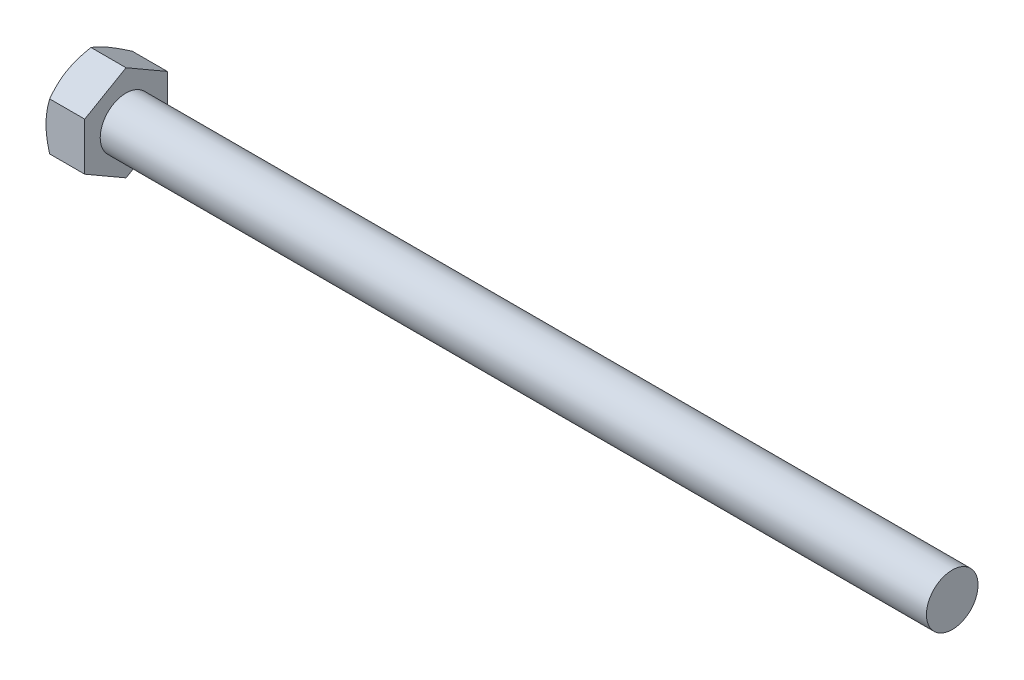
ISO-10303-21;
HEADER;
FILE_DESCRIPTION(('STEP AP214'),'2;1');
FILE_NAME('part.step','',(''),(''),'','','');
FILE_SCHEMA(('AUTOMOTIVE_DESIGN { 1 0 10303 214 1 1 1 1 }'));
ENDSEC;
DATA;
#1=APPLICATION_CONTEXT('core data for automotive mechanical design processes');
#2=APPLICATION_PROTOCOL_DEFINITION('international standard','automotive_design',2000,#1);
#3=PRODUCT_CONTEXT('',#1,'mechanical');
#4=PRODUCT('Part','Part','',(#3));
#5=PRODUCT_RELATED_PRODUCT_CATEGORY('part','',(#4));
#6=PRODUCT_DEFINITION_FORMATION('','',#4);
#7=PRODUCT_DEFINITION_CONTEXT('part definition',#1,'design');
#8=PRODUCT_DEFINITION('design','',#6,#7);
#9=PRODUCT_DEFINITION_SHAPE('','',#8);
#10=(LENGTH_UNIT() NAMED_UNIT(*) SI_UNIT(.MILLI.,.METRE.));
#11=(NAMED_UNIT(*) PLANE_ANGLE_UNIT() SI_UNIT($,.RADIAN.));
#12=(NAMED_UNIT(*) SI_UNIT($,.STERADIAN.) SOLID_ANGLE_UNIT());
#13=UNCERTAINTY_MEASURE_WITH_UNIT(LENGTH_MEASURE(1.E-05),#10,'distance_accuracy_value','');
#14=(GEOMETRIC_REPRESENTATION_CONTEXT(3) GLOBAL_UNCERTAINTY_ASSIGNED_CONTEXT((#13)) GLOBAL_UNIT_ASSIGNED_CONTEXT((#10,
#11,#12)) REPRESENTATION_CONTEXT('',''));
#15=CARTESIAN_POINT('',(0.,0.,0.));
#16=DIRECTION('',(0.,0.,1.));
#17=DIRECTION('',(1.,0.,0.));
#18=AXIS2_PLACEMENT_3D('',#15,#16,#17);
#19=CARTESIAN_POINT('',(7.5,5.,0.));
#20=DIRECTION('',(-1.,0.,0.));
#21=DIRECTION('',(0.,0.,1.));
#22=AXIS2_PLACEMENT_3D('',#19,#20,#21);
#23=PLANE('',#22);
#24=CARTESIAN_POINT('',(7.5,0.,0.));
#25=DIRECTION('',(-1.,0.,0.));
#26=DIRECTION('',(0.,0.,1.));
#27=AXIS2_PLACEMENT_3D('',#24,#25,#26);
#28=CIRCLE('',#27,5.);
#29=CARTESIAN_POINT('',(7.5,0.,5.));
#30=VERTEX_POINT('',#29);
#31=EDGE_CURVE('E196',#30,#30,#28,.T.);
#32=ORIENTED_EDGE('',*,*,#31,.T.);
#33=EDGE_LOOP('',(#32));
#34=FACE_BOUND('',#33,.T.);
#35=DIRECTION('',(0.,1.,0.));
#36=VECTOR('',#35,1.);
#37=CARTESIAN_POINT('',(7.5,-4.61880217370055,8.));
#38=LINE('',#37,#36);
#39=CARTESIAN_POINT('',(7.5,-4.61880217370055,8.));
#40=VERTEX_POINT('',#39);
#41=CARTESIAN_POINT('',(7.5,4.61880217370081,8.));
#42=VERTEX_POINT('',#41);
#43=EDGE_CURVE('E56',#40,#42,#38,.T.);
#44=ORIENTED_EDGE('',*,*,#43,.F.);
#45=DIRECTION('',(0.,0.500000001638709,0.866025402838329));
#46=VECTOR('',#45,1.);
#47=CARTESIAN_POINT('',(7.5,-9.23760434740122,0.));
#48=LINE('',#47,#46);
#49=CARTESIAN_POINT('',(7.5,-9.23760434740122,0.));
#50=VERTEX_POINT('',#49);
#51=EDGE_CURVE('E129',#50,#40,#48,.T.);
#52=ORIENTED_EDGE('',*,*,#51,.F.);
#53=DIRECTION('',(0.,-0.50000000163871,0.866025402838329));
#54=VECTOR('',#53,1.);
#55=CARTESIAN_POINT('',(7.5,-4.61880217370055,-8.));
#56=LINE('',#55,#54);
#57=CARTESIAN_POINT('',(7.5,-4.61880217370055,-8.));
#58=VERTEX_POINT('',#57);
#59=EDGE_CURVE('E127',#58,#50,#56,.T.);
#60=ORIENTED_EDGE('',*,*,#59,.F.);
#61=DIRECTION('',(0.,-1.,0.));
#62=VECTOR('',#61,1.);
#63=CARTESIAN_POINT('',(7.5,4.61880217370081,-8.));
#64=LINE('',#63,#62);
#65=CARTESIAN_POINT('',(7.5,4.61880217370081,-8.));
#66=VERTEX_POINT('',#65);
#67=EDGE_CURVE('E110',#66,#58,#64,.T.);
#68=ORIENTED_EDGE('',*,*,#67,.F.);
#69=DIRECTION('',(0.,-0.50000000163871,-0.866025402838329));
#70=VECTOR('',#69,1.);
#71=CARTESIAN_POINT('',(7.5,9.23760434740148,0.));
#72=LINE('',#71,#70);
#73=CARTESIAN_POINT('',(7.5,9.23760434740148,0.));
#74=VERTEX_POINT('',#73);
#75=EDGE_CURVE('E119',#74,#66,#72,.T.);
#76=ORIENTED_EDGE('',*,*,#75,.F.);
#77=DIRECTION('',(0.,0.50000000163871,-0.866025402838329));
#78=VECTOR('',#77,1.);
#79=CARTESIAN_POINT('',(7.5,4.61880217370081,8.));
#80=LINE('',#79,#78);
#81=EDGE_CURVE('E123',#42,#74,#80,.T.);
#82=ORIENTED_EDGE('',*,*,#81,.F.);
#83=EDGE_LOOP('',(#44,#52,#60,#68,#76,#82));
#84=FACE_BOUND('',#83,.T.);
#85=ADVANCED_FACE('F33',(#34,#84),#23,.F.);
#86=CARTESIAN_POINT('',(-25.4,0.,0.));
#87=DIRECTION('',(-1.,0.,0.));
#88=DIRECTION('',(0.,0.,1.));
#89=AXIS2_PLACEMENT_3D('',#86,#87,#88);
#90=CYLINDRICAL_SURFACE('',#89,5.);
#91=CARTESIAN_POINT('',(167.5,0.,0.));
#92=DIRECTION('',(-1.,0.,0.));
#93=DIRECTION('',(0.,0.,1.));
#94=AXIS2_PLACEMENT_3D('',#91,#92,#93);
#95=CIRCLE('',#94,5.);
#96=CARTESIAN_POINT('',(167.5,0.,5.));
#97=VERTEX_POINT('',#96);
#98=EDGE_CURVE('E11',#97,#97,#95,.T.);
#99=ORIENTED_EDGE('',*,*,#98,.T.);
#100=EDGE_LOOP('',(#99));
#101=FACE_BOUND('',#100,.T.);
#102=ORIENTED_EDGE('',*,*,#31,.F.);
#103=EDGE_LOOP('',(#102));
#104=FACE_BOUND('',#103,.T.);
#105=ADVANCED_FACE('F35',(#101,#104),#90,.T.);
#106=CARTESIAN_POINT('',(167.5,5.,0.));
#107=DIRECTION('',(1.,0.,0.));
#108=DIRECTION('',(0.,0.,-1.));
#109=AXIS2_PLACEMENT_3D('',#106,#107,#108);
#110=PLANE('',#109);
#111=ORIENTED_EDGE('',*,*,#98,.F.);
#112=EDGE_LOOP('',(#111));
#113=FACE_BOUND('',#112,.T.);
#114=ADVANCED_FACE('F177',(#113),#110,.T.);
#115=CARTESIAN_POINT('',(7.5,-4.61880217370055,8.));
#116=DIRECTION('',(0.,0.,1.));
#117=DIRECTION('',(0.,-1.,0.));
#118=AXIS2_PLACEMENT_3D('',#115,#116,#117);
#119=PLANE('',#118);
#120=DIRECTION('',(-1.,0.,0.));
#121=VECTOR('',#120,1.);
#122=CARTESIAN_POINT('',(7.5,-4.61880217370055,8.));
#123=LINE('',#122,#121);
#124=CARTESIAN_POINT('',(0.714531185642814,-4.61880217370055,8.));
#125=VERTEX_POINT('',#124);
#126=EDGE_CURVE('E136',#40,#125,#123,.T.);
#127=ORIENTED_EDGE('',*,*,#126,.F.);
#128=ORIENTED_EDGE('',*,*,#43,.T.);
#129=DIRECTION('',(-1.,0.,0.));
#130=VECTOR('',#129,1.);
#131=CARTESIAN_POINT('',(7.5,4.61880217370081,8.));
#132=LINE('',#131,#130);
#133=CARTESIAN_POINT('',(0.714531185642887,4.61880217370081,8.));
#134=VERTEX_POINT('',#133);
#135=EDGE_CURVE('E135',#42,#134,#132,.T.);
#136=ORIENTED_EDGE('',*,*,#135,.T.);
#137=CARTESIAN_POINT('',(3.82822414101115,-12.2497656982226,8.));
#138=CARTESIAN_POINT('',(3.65848286879736,-11.8985202843054,8.));
#139=CARTESIAN_POINT('',(3.49042895769106,-11.546444421205,8.));
#140=CARTESIAN_POINT('',(3.15866007606797,-10.8401827517385,8.));
#141=CARTESIAN_POINT('',(2.99494585678539,-10.4859965928938,8.));
#142=CARTESIAN_POINT('',(2.67195812645104,-9.77315201266955,8.));
#143=CARTESIAN_POINT('',(2.51271538890513,-9.41447959727726,8.));
#144=CARTESIAN_POINT('',(2.20106973608564,-8.6941868708221,8.));
#145=CARTESIAN_POINT('',(2.04866646428538,-8.33256671458254,8.));
#146=CARTESIAN_POINT('',(1.75070912610617,-7.60131370455928,8.));
#147=CARTESIAN_POINT('',(1.60526212024156,-7.23163698414151,8.));
#148=CARTESIAN_POINT('',(1.32575932370829,-6.487924160903,8.));
#149=CARTESIAN_POINT('',(1.19170480039105,-6.11388757832081,8.));
#150=CARTESIAN_POINT('',(0.938589488850542,-5.36162356561332,8.));
#151=CARTESIAN_POINT('',(0.819496824182946,-4.98340697934676,8.));
#152=CARTESIAN_POINT('',(0.600170997908562,-4.22161055060635,8.));
#153=CARTESIAN_POINT('',(0.499931872278403,-3.83803244555409,8.));
#154=CARTESIAN_POINT('',(0.323186748232363,-3.06518689861531,8.));
#155=CARTESIAN_POINT('',(0.246687067909599,-2.67591797096946,8.));
#156=CARTESIAN_POINT('',(0.153572527253884,-2.08858914234208,8.));
#157=CARTESIAN_POINT('',(0.126138156302342,-1.8922178640948,8.));
#158=CARTESIAN_POINT('',(0.0790208692877559,-1.49855462524935,8.));
#159=CARTESIAN_POINT('',(0.0593371858268336,-1.30126275775715,8.));
#160=CARTESIAN_POINT('',(0.0282509892994569,-0.907276578206894,8.));
#161=CARTESIAN_POINT('',(0.0167970522476313,-0.710586340026115,8.));
#162=CARTESIAN_POINT('',(0.00223090595896762,-0.316897324952118,8.));
#163=CARTESIAN_POINT('',(-0.000881411608064448,-0.119898552098995,8.));
#164=CARTESIAN_POINT('',(0.00130984053934154,0.27399753841406,8.));
#165=CARTESIAN_POINT('',(0.00661104833168806,0.470894869030629,8.));
#166=CARTESIAN_POINT('',(0.0254975236721206,0.864294473957556,8.));
#167=CARTESIAN_POINT('',(0.0390832049236028,1.06079672804721,8.));
#168=CARTESIAN_POINT('',(0.0817669665798386,1.53705699197599,8.));
#169=CARTESIAN_POINT('',(0.115015825491784,1.81644908989183,8.));
#170=CARTESIAN_POINT('',(0.196415724202097,2.37309234461894,8.));
#171=CARTESIAN_POINT('',(0.244570831513706,2.65034289586915,8.));
#172=CARTESIAN_POINT('',(0.354075319593893,3.20247432368565,8.));
#173=CARTESIAN_POINT('',(0.415437175577183,3.47735270235345,8.));
#174=CARTESIAN_POINT('',(0.549482936842529,4.02428135859502,8.));
#175=CARTESIAN_POINT('',(0.622165775535711,4.29633190001607,8.));
#176=CARTESIAN_POINT('',(0.77901457585663,4.8443054564892,8.));
#177=CARTESIAN_POINT('',(0.863418343438941,5.12015993256326,8.));
#178=CARTESIAN_POINT('',(1.04056550506417,5.66895309638315,8.));
#179=CARTESIAN_POINT('',(1.13330314694985,5.94189365197878,8.));
#180=CARTESIAN_POINT('',(1.32520246628364,6.48376376437684,8.));
#181=CARTESIAN_POINT('',(1.4243250469162,6.75270725047684,8.));
#182=CARTESIAN_POINT('',(1.62838816906516,7.28850759026012,8.));
#183=CARTESIAN_POINT('',(1.73333106198454,7.55536355016897,8.));
#184=CARTESIAN_POINT('',(1.84060835471514,7.82125004980532,8.));
#185=B_SPLINE_CURVE_WITH_KNOTS('',3,(#137,#138,#139,#140,#141,#142,#143,#144,#145,#146,#147,
#148,#149,#150,#151,#152,#153,#154,#155,#156,#157,#158,#159,#160,#161,#162,#163,#164,#165,#166,
#167,#168,#169,#170,#171,#172,#173,#174,#175,#176,#177,#178,#179,#180,#181,#182,#183,#184),
.UNSPECIFIED.,.F.,.F.,(4,2,2,2,2,2,2,2,2,2,2,2,2,2,2,2,2,2,2,2,2,2,2,4),(0.,1.17034426617222,
2.34088982216394,3.51813389970139,4.6953165385788,5.88695165739568,7.07871916605351,
8.2679029134146,9.45670984600032,10.6458329007116,11.2405391306507,11.8351864637341,
12.4260850123376,13.0169758870758,13.6077009108412,14.1984554361754,15.0420758899104,
15.8859267481502,16.7305782416716,17.5751502057393,18.4404245595524,19.3051062097701,
20.1649208601746,21.0250854420212),.UNSPECIFIED.);
#186=CARTESIAN_POINT('',(0.,0.,8.));
#187=VERTEX_POINT('',#186);
#188=EDGE_CURVE('E179',#187,#134,#185,.T.);
#189=ORIENTED_EDGE('',*,*,#188,.F.);
#190=EDGE_CURVE('E187',#125,#187,#185,.T.);
#191=ORIENTED_EDGE('',*,*,#190,.F.);
#192=EDGE_LOOP('',(#127,#128,#136,#189,#191));
#193=FACE_BOUND('',#192,.T.);
#194=ADVANCED_FACE('F173',(#193),#119,.T.);
#195=CARTESIAN_POINT('',(7.5,-9.23760434740122,0.));
#196=DIRECTION('',(0.,-0.866025402838329,0.500000001638709));
#197=DIRECTION('',(0.,-0.50000000163871,-0.86602540283833));
#198=AXIS2_PLACEMENT_3D('',#195,#196,#197);
#199=PLANE('',#198);
#200=DIRECTION('',(-1.,0.,0.));
#201=VECTOR('',#200,1.);
#202=CARTESIAN_POINT('',(7.5,-9.23760434740122,0.));
#203=LINE('',#202,#201);
#204=CARTESIAN_POINT('',(0.714531203122347,-9.23760434740122,0.));
#205=VERTEX_POINT('',#204);
#206=EDGE_CURVE('E140',#50,#205,#203,.T.);
#207=ORIENTED_EDGE('',*,*,#206,.F.);
#208=ORIENTED_EDGE('',*,*,#51,.T.);
#209=ORIENTED_EDGE('',*,*,#126,.T.);
#210=CARTESIAN_POINT('',(0.714597871039289,-9.23771981745557,-0.000200000000002933));
#211=CARTESIAN_POINT('',(0.655990736923303,-9.13619347400029,0.175648784402792));
#212=CARTESIAN_POINT('',(0.600043423495616,-9.03428860437912,0.352153195354022));
#213=CARTESIAN_POINT('',(0.494201026626133,-8.82965126370277,0.706595464982374));
#214=CARTESIAN_POINT('',(0.444308555613357,-8.7269184556666,0.884533907327666));
#215=CARTESIAN_POINT('',(0.30469281714608,-8.41707515629909,1.42119824187181));
#216=CARTESIAN_POINT('',(0.225281190112559,-8.20874157525887,1.78204258757938));
#217=CARTESIAN_POINT('',(0.132161664305383,-7.89697439751329,2.32203917720735));
#218=CARTESIAN_POINT('',(0.105634598683677,-7.79447219608365,2.49957819719532));
#219=CARTESIAN_POINT('',(0.0611531918321778,-7.58900424766936,2.85545912162066));
#220=CARTESIAN_POINT('',(0.0431980931629678,-7.4860385424529,3.03380095371339));
#221=CARTESIAN_POINT('',(0.0163156645301111,-7.27992984087247,3.39079169517273));
#222=CARTESIAN_POINT('',(0.00737808929916338,-7.17678717937825,3.56944002452792));
#223=CARTESIAN_POINT('',(-0.00127768080583362,-6.97040657400776,3.92690171716437));
#224=CARTESIAN_POINT('',(-0.000996160506704941,-6.86716863317371,4.10571507517634));
#225=CARTESIAN_POINT('',(0.00814503983248396,-6.67416141624368,4.44001337966577));
#226=CARTESIAN_POINT('',(0.0158896186877163,-6.58437852030024,4.59552191641092));
#227=CARTESIAN_POINT('',(0.0382011486356475,-6.40502300933048,4.90617477267051));
#228=CARTESIAN_POINT('',(0.0527685596255872,-6.31545040888835,5.06131906692437));
#229=CARTESIAN_POINT('',(0.106360703064376,-6.04707937863194,5.52615132457682));
#230=CARTESIAN_POINT('',(0.155268653484355,-5.86875598870038,5.83501649476649));
#231=CARTESIAN_POINT('',(0.277539413477509,-5.51021757899271,6.45602323413139));
#232=CARTESIAN_POINT('',(0.351420529762536,-5.33004831822991,6.768085546371));
#233=CARTESIAN_POINT('',(0.519100148881199,-4.97239660419655,7.38755648378386));
#234=CARTESIAN_POINT('',(0.612859267577917,-4.79490957082323,7.69497304192775));
#235=CARTESIAN_POINT('',(0.714597853559101,-4.61868670364621,8.0002));
#236=B_SPLINE_CURVE_WITH_KNOTS('',3,(#210,#211,#212,#213,#214,#215,#216,#217,#218,#219,#220,
#221,#222,#223,#224,#225,#226,#227,#228,#229,#230,#231,#232,#233,#234,#235),.UNSPECIFIED.,.F.,
.F.,(4,2,2,2,2,2,2,2,2,2,2,2,4),(0.,0.633973546459013,1.26821966262013,2.53934713534089,
3.15934345345195,3.77928497706708,4.39852135771862,5.01773860688775,5.55680241439713,
6.09590256306806,7.17487079008232,8.27776851436756,9.37850116222514),.UNSPECIFIED.);
#237=CARTESIAN_POINT('',(0.,-6.92820324541317,4.0000000262193));
#238=VERTEX_POINT('',#237);
#239=EDGE_CURVE('E189',#238,#125,#236,.T.);
#240=ORIENTED_EDGE('',*,*,#239,.F.);
#241=EDGE_CURVE('E188',#205,#238,#236,.T.);
#242=ORIENTED_EDGE('',*,*,#241,.F.);
#243=EDGE_LOOP('',(#207,#208,#209,#240,#242));
#244=FACE_BOUND('',#243,.T.);
#245=ADVANCED_FACE('F176',(#244),#199,.T.);
#246=CARTESIAN_POINT('',(7.5,-4.61880217370055,-8.));
#247=DIRECTION('',(0.,-0.866025402838329,-0.50000000163871));
#248=DIRECTION('',(0.,0.50000000163871,-0.866025402838329));
#249=AXIS2_PLACEMENT_3D('',#246,#247,#248);
#250=PLANE('',#249);
#251=DIRECTION('',(-1.,0.,0.));
#252=VECTOR('',#251,1.);
#253=CARTESIAN_POINT('',(7.5,-4.61880217370055,-8.));
#254=LINE('',#253,#252);
#255=CARTESIAN_POINT('',(0.714531185642814,-4.61880217370055,-8.));
#256=VERTEX_POINT('',#255);
#257=EDGE_CURVE('E116',#58,#256,#254,.T.);
#258=ORIENTED_EDGE('',*,*,#257,.F.);
#259=ORIENTED_EDGE('',*,*,#59,.T.);
#260=ORIENTED_EDGE('',*,*,#206,.T.);
#261=CARTESIAN_POINT('',(0.714597853559102,-4.61868670364621,-8.0002));
#262=CARTESIAN_POINT('',(0.655990720160656,-4.72021304685638,-7.82435121602175));
#263=CARTESIAN_POINT('',(0.600043407468511,-4.82211791623125,-7.64784680549711));
#264=CARTESIAN_POINT('',(0.494201012103502,-5.02675525640989,-7.29340453673082));
#265=CARTESIAN_POINT('',(0.444308541859671,-5.12948806419463,-7.11546609482101));
#266=CARTESIAN_POINT('',(0.304692805754267,-5.43933136278073,-6.57880176163032));
#267=CARTESIAN_POINT('',(0.225281180357153,-5.64766494327923,-6.21795741686103));
#268=CARTESIAN_POINT('',(0.132161657001097,-5.95943212018714,-5.67796082868395));
#269=CARTESIAN_POINT('',(0.105634592184732,-6.06193432134328,-5.5004218091697));
#270=CARTESIAN_POINT('',(0.0611531869346931,-6.2674022691947,-5.14454088571928));
#271=CARTESIAN_POINT('',(0.043198089061611,-6.37036797412179,-4.96619905412775));
#272=CARTESIAN_POINT('',(0.0163156619914865,-6.57647667510862,-4.60920831369654));
#273=CARTESIAN_POINT('',(0.00737808752735882,-6.67961933629864,-4.43055998486825));
#274=CARTESIAN_POINT('',(-0.00127768109245702,-6.88599994104392,-4.07309829331471));
#275=CARTESIAN_POINT('',(-0.000996160074949981,-6.98923788155696,-3.89428493585874));
#276=CARTESIAN_POINT('',(0.00814504157393716,-7.18224509847458,-3.5599866313908));
#277=CARTESIAN_POINT('',(0.015889621075361,-7.27202799472783,-3.40447809410903));
#278=CARTESIAN_POINT('',(0.0382011523455289,-7.45138350630451,-3.09382523679824));
#279=CARTESIAN_POINT('',(0.0527685640115247,-7.54095610704372,-2.93868094202981));
#280=CARTESIAN_POINT('',(0.106360709504679,-7.80932713817435,-2.47384868286318));
#281=CARTESIAN_POINT('',(0.155268661328168,-7.98765052866423,-2.16498351170646));
#282=CARTESIAN_POINT('',(0.277539424141198,-8.34618893947704,-1.54397677042741));
#283=CARTESIAN_POINT('',(0.351420541844036,-8.52635820078562,-1.23191445724248));
#284=CARTESIAN_POINT('',(0.519100163726596,-8.88400991587941,-0.612443517992909));
#285=CARTESIAN_POINT('',(0.612859283768842,-9.0614969497675,-0.305026958957413));
#286=CARTESIAN_POINT('',(0.714597871039288,-9.23771981745556,0.000199999999995336));
#287=B_SPLINE_CURVE_WITH_KNOTS('',3,(#261,#262,#263,#264,#265,#266,#267,#268,#269,#270,#271,
#272,#273,#274,#275,#276,#277,#278,#279,#280,#281,#282,#283,#284,#285,#286),.UNSPECIFIED.,.F.,
.F.,(4,2,2,2,2,2,2,2,2,2,2,2,4),(0.,0.633973544448733,1.26821965859846,2.539347127198,
3.1593434433715,3.77928496504979,4.39852134377931,5.01773859102754,5.55680240047656,
6.09590255108796,7.17487078199376,8.27776851034646,9.37850116222566),.UNSPECIFIED.);
#288=CARTESIAN_POINT('',(0.,-6.92820324541317,-4.0000000262193));
#289=VERTEX_POINT('',#288);
#290=EDGE_CURVE('E219',#289,#205,#287,.T.);
#291=ORIENTED_EDGE('',*,*,#290,.F.);
#292=EDGE_CURVE('E224',#256,#289,#287,.T.);
#293=ORIENTED_EDGE('',*,*,#292,.F.);
#294=EDGE_LOOP('',(#258,#259,#260,#291,#293));
#295=FACE_BOUND('',#294,.T.);
#296=ADVANCED_FACE('F295',(#295),#250,.T.);
#297=CARTESIAN_POINT('',(7.5,4.61880217370081,-8.));
#298=DIRECTION('',(0.,0.,-1.));
#299=DIRECTION('',(-1.,0.,0.));
#300=AXIS2_PLACEMENT_3D('',#297,#298,#299);
#301=PLANE('',#300);
#302=DIRECTION('',(-1.,0.,0.));
#303=VECTOR('',#302,1.);
#304=CARTESIAN_POINT('',(7.5,4.61880217370081,-8.));
#305=LINE('',#304,#303);
#306=CARTESIAN_POINT('',(0.714531185642888,4.61880217370081,-8.));
#307=VERTEX_POINT('',#306);
#308=EDGE_CURVE('E105',#66,#307,#305,.T.);
#309=ORIENTED_EDGE('',*,*,#308,.F.);
#310=ORIENTED_EDGE('',*,*,#67,.T.);
#311=ORIENTED_EDGE('',*,*,#257,.T.);
#312=CARTESIAN_POINT('',(3.82822414101115,-12.2497656982226,-8.));
#313=CARTESIAN_POINT('',(3.65848286879736,-11.8985202843054,-8.));
#314=CARTESIAN_POINT('',(3.49042895769106,-11.546444421205,-8.));
#315=CARTESIAN_POINT('',(3.15866007606797,-10.8401827517385,-8.));
#316=CARTESIAN_POINT('',(2.99494585678539,-10.4859965928938,-8.));
#317=CARTESIAN_POINT('',(2.67195812645104,-9.77315201266955,-8.));
#318=CARTESIAN_POINT('',(2.51271538890513,-9.41447959727726,-8.));
#319=CARTESIAN_POINT('',(2.20106973608564,-8.6941868708221,-8.));
#320=CARTESIAN_POINT('',(2.04866646428538,-8.33256671458254,-8.));
#321=CARTESIAN_POINT('',(1.75070912610617,-7.60131370455928,-8.));
#322=CARTESIAN_POINT('',(1.60526212024156,-7.23163698414151,-8.));
#323=CARTESIAN_POINT('',(1.32575932370829,-6.487924160903,-8.));
#324=CARTESIAN_POINT('',(1.19170480039105,-6.11388757832081,-8.));
#325=CARTESIAN_POINT('',(0.938589488850542,-5.36162356561332,-8.));
#326=CARTESIAN_POINT('',(0.819496824182947,-4.98340697934676,-8.));
#327=CARTESIAN_POINT('',(0.600170997908562,-4.22161055060635,-8.));
#328=CARTESIAN_POINT('',(0.499931872278403,-3.83803244555409,-8.));
#329=CARTESIAN_POINT('',(0.323186748232363,-3.06518689861531,-8.));
#330=CARTESIAN_POINT('',(0.246687067909599,-2.67591797096946,-8.));
#331=CARTESIAN_POINT('',(0.153572527253885,-2.08858914234208,-8.));
#332=CARTESIAN_POINT('',(0.126138156302343,-1.8922178640948,-8.));
#333=CARTESIAN_POINT('',(0.0790208692877563,-1.49855462524935,-8.));
#334=CARTESIAN_POINT('',(0.059337185826834,-1.30126275775715,-8.));
#335=CARTESIAN_POINT('',(0.0282509892994573,-0.907276578206893,-8.));
#336=CARTESIAN_POINT('',(0.0167970522476317,-0.710586340026114,-8.));
#337=CARTESIAN_POINT('',(0.0022309059589681,-0.316897324952118,-8.));
#338=CARTESIAN_POINT('',(-0.000881411608063976,-0.119898552098995,-8.));
#339=CARTESIAN_POINT('',(0.00130984053934208,0.27399753841406,-8.));
#340=CARTESIAN_POINT('',(0.00661104833168869,0.470894869030628,-8.));
#341=CARTESIAN_POINT('',(0.0254975236721212,0.864294473957555,-8.));
#342=CARTESIAN_POINT('',(0.0390832049236034,1.0607967280472,-8.));
#343=CARTESIAN_POINT('',(0.0817669665798393,1.53705699197599,-8.));
#344=CARTESIAN_POINT('',(0.115015825491784,1.81644908989183,-8.));
#345=CARTESIAN_POINT('',(0.196415724202097,2.37309234461894,-8.));
#346=CARTESIAN_POINT('',(0.244570831513706,2.65034289586915,-8.));
#347=CARTESIAN_POINT('',(0.354075319593893,3.20247432368565,-8.));
#348=CARTESIAN_POINT('',(0.415437175577183,3.47735270235344,-8.));
#349=CARTESIAN_POINT('',(0.549482936842529,4.02428135859502,-8.));
#350=CARTESIAN_POINT('',(0.622165775535711,4.29633190001607,-8.));
#351=CARTESIAN_POINT('',(0.77901457585663,4.84430545648919,-8.));
#352=CARTESIAN_POINT('',(0.863418343438941,5.12015993256325,-8.));
#353=CARTESIAN_POINT('',(1.04056550506417,5.66895309638315,-8.));
#354=CARTESIAN_POINT('',(1.13330314694985,5.94189365197878,-8.));
#355=CARTESIAN_POINT('',(1.32520246628364,6.48376376437684,-8.));
#356=CARTESIAN_POINT('',(1.4243250469162,6.75270725047684,-8.));
#357=CARTESIAN_POINT('',(1.62838816906517,7.28850759026012,-8.));
#358=CARTESIAN_POINT('',(1.73333106198454,7.55536355016897,-8.));
#359=CARTESIAN_POINT('',(1.84060835471514,7.82125004980532,-8.));
#360=B_SPLINE_CURVE_WITH_KNOTS('',3,(#312,#313,#314,#315,#316,#317,#318,#319,#320,#321,#322,
#323,#324,#325,#326,#327,#328,#329,#330,#331,#332,#333,#334,#335,#336,#337,#338,#339,#340,#341,
#342,#343,#344,#345,#346,#347,#348,#349,#350,#351,#352,#353,#354,#355,#356,#357,#358,#359),
.UNSPECIFIED.,.F.,.F.,(4,2,2,2,2,2,2,2,2,2,2,2,2,2,2,2,2,2,2,2,2,2,2,4),(0.,1.17034426617222,
2.34088982216393,3.51813389970139,4.6953165385788,5.88695165739568,7.07871916605351,
8.2679029134146,9.45670984600032,10.6458329007116,11.2405391306507,11.8351864637341,
12.4260850123376,13.0169758870758,13.6077009108412,14.1984554361754,15.0420758899104,
15.8859267481502,16.7305782416716,17.5751502057393,18.4404245595524,19.3051062097701,
20.1649208601746,21.0250854420212),.UNSPECIFIED.);
#361=CARTESIAN_POINT('',(0.,0.,-8.));
#362=VERTEX_POINT('',#361);
#363=EDGE_CURVE('E220',#362,#256,#360,.F.);
#364=ORIENTED_EDGE('',*,*,#363,.F.);
#365=EDGE_CURVE('E113',#307,#362,#360,.F.);
#366=ORIENTED_EDGE('',*,*,#365,.F.);
#367=EDGE_LOOP('',(#309,#310,#311,#364,#366));
#368=FACE_BOUND('',#367,.T.);
#369=ADVANCED_FACE('F107',(#368),#301,.T.);
#370=CARTESIAN_POINT('',(7.5,9.23760434740148,0.));
#371=DIRECTION('',(0.,0.866025402838329,-0.50000000163871));
#372=DIRECTION('',(0.,0.50000000163871,0.866025402838329));
#373=AXIS2_PLACEMENT_3D('',#370,#371,#372);
#374=PLANE('',#373);
#375=DIRECTION('',(-1.,0.,0.));
#376=VECTOR('',#375,1.);
#377=CARTESIAN_POINT('',(7.5,9.23760434740148,0.));
#378=LINE('',#377,#376);
#379=CARTESIAN_POINT('',(0.714531203122496,9.23760434740148,0.));
#380=VERTEX_POINT('',#379);
#381=EDGE_CURVE('E48',#74,#380,#378,.T.);
#382=ORIENTED_EDGE('',*,*,#381,.F.);
#383=ORIENTED_EDGE('',*,*,#75,.T.);
#384=ORIENTED_EDGE('',*,*,#308,.T.);
#385=CARTESIAN_POINT('',(0.714597871039439,9.23771981745583,0.000199999999998613));
#386=CARTESIAN_POINT('',(0.655990736923451,9.13619347400054,-0.175648784402801));
#387=CARTESIAN_POINT('',(0.600043423495762,9.03428860437938,-0.352153195354035));
#388=CARTESIAN_POINT('',(0.494201026626276,8.82965126370302,-0.706595464982398));
#389=CARTESIAN_POINT('',(0.444308555613498,8.72691845566684,-0.884533907327695));
#390=CARTESIAN_POINT('',(0.304692817146218,8.41707515629932,-1.42119824187185));
#391=CARTESIAN_POINT('',(0.225281190112694,8.2087415752591,-1.78204258757944));
#392=CARTESIAN_POINT('',(0.132161664305516,7.89697439751351,-2.32203917720742));
#393=CARTESIAN_POINT('',(0.105634598683809,7.79447219608387,-2.4995781971954));
#394=CARTESIAN_POINT('',(0.0611531918323089,7.58900424766957,-2.85545912162075));
#395=CARTESIAN_POINT('',(0.0431980931630988,7.48603854245311,-3.03380095371348));
#396=CARTESIAN_POINT('',(0.0163156645302413,7.27992984087267,-3.39079169517283));
#397=CARTESIAN_POINT('',(0.0073780892992931,7.17678717937845,-3.56944002452803));
#398=CARTESIAN_POINT('',(-0.00127768080570471,6.97040657400795,-3.92690171716449));
#399=CARTESIAN_POINT('',(-0.000996160506576266,6.8671686331739,-4.10571507517646));
#400=CARTESIAN_POINT('',(0.00814503983261286,6.67416141624387,-4.44001337966589));
#401=CARTESIAN_POINT('',(0.0158896186878451,6.58437852030044,-4.59552191641103));
#402=CARTESIAN_POINT('',(0.0382011486357756,6.40502300933068,-4.90617477267062));
#403=CARTESIAN_POINT('',(0.0527685596257146,6.31545040888856,-5.06131906692447));
#404=CARTESIAN_POINT('',(0.1063607030645,6.04707937863215,-5.5261513245769));
#405=CARTESIAN_POINT('',(0.155268653484475,5.8687559887006,-5.83501649476656));
#406=CARTESIAN_POINT('',(0.277539413477617,5.51021757899294,-6.45602323413144));
#407=CARTESIAN_POINT('',(0.351420529762638,5.33004831823015,-6.76808554637104));
#408=CARTESIAN_POINT('',(0.519100148881287,4.97239660419679,-7.38755648378388));
#409=CARTESIAN_POINT('',(0.612859267577997,4.79490957082348,-7.69497304192776));
#410=CARTESIAN_POINT('',(0.714597853559175,4.61868670364646,-8.0002));
#411=B_SPLINE_CURVE_WITH_KNOTS('',3,(#385,#386,#387,#388,#389,#390,#391,#392,#393,#394,#395,
#396,#397,#398,#399,#400,#401,#402,#403,#404,#405,#406,#407,#408,#409,#410),.UNSPECIFIED.,.F.,
.F.,(4,2,2,2,2,2,2,2,2,2,2,2,4),(0.,0.633973546459031,1.26821966262016,2.53934713534096,
3.15934345345203,3.77928497706718,4.39852135771874,5.01773860688789,5.55680241439726,
6.09590256306816,7.17487079008239,8.27776851436759,9.37850116222513),.UNSPECIFIED.);
#412=CARTESIAN_POINT('',(0.,6.92820324541336,-4.00000002621941));
#413=VERTEX_POINT('',#412);
#414=EDGE_CURVE('E155',#413,#307,#411,.T.);
#415=ORIENTED_EDGE('',*,*,#414,.F.);
#416=EDGE_CURVE('E283',#380,#413,#411,.T.);
#417=ORIENTED_EDGE('',*,*,#416,.F.);
#418=EDGE_LOOP('',(#382,#383,#384,#415,#417));
#419=FACE_BOUND('',#418,.T.);
#420=ADVANCED_FACE('F120',(#419),#374,.T.);
#421=CARTESIAN_POINT('',(7.5,4.61880217370081,8.));
#422=DIRECTION('',(0.,0.866025402838329,0.50000000163871));
#423=DIRECTION('',(0.,-0.50000000163871,0.866025402838329));
#424=AXIS2_PLACEMENT_3D('',#421,#422,#423);
#425=PLANE('',#424);
#426=ORIENTED_EDGE('',*,*,#135,.F.);
#427=ORIENTED_EDGE('',*,*,#81,.T.);
#428=ORIENTED_EDGE('',*,*,#381,.T.);
#429=CARTESIAN_POINT('',(0.714597853559175,4.61868670364646,8.0002));
#430=CARTESIAN_POINT('',(0.655990720160732,4.72021304685664,7.82435121602175));
#431=CARTESIAN_POINT('',(0.600043407468588,4.82211791623151,7.6478468054971));
#432=CARTESIAN_POINT('',(0.494201012103581,5.02675525641015,7.29340453673081));
#433=CARTESIAN_POINT('',(0.444308541859752,5.1294880641949,7.11546609482099));
#434=CARTESIAN_POINT('',(0.304692805754354,5.439331362781,6.57880176163029));
#435=CARTESIAN_POINT('',(0.225281180357247,5.6476649432795,6.217957416861));
#436=CARTESIAN_POINT('',(0.132161657001198,5.95943212018742,5.67796082868391));
#437=CARTESIAN_POINT('',(0.105634592184834,6.06193432134356,5.50042180916966));
#438=CARTESIAN_POINT('',(0.0611531869348008,6.26740226919499,5.14454088571923));
#439=CARTESIAN_POINT('',(0.0431980890617219,6.37036797412208,4.96619905412769));
#440=CARTESIAN_POINT('',(0.0163156619916036,6.57647667510891,4.60920831369649));
#441=CARTESIAN_POINT('',(0.0073780875274788,6.67961933629893,4.43055998486819));
#442=CARTESIAN_POINT('',(-0.00127768109233111,6.88599994104421,4.07309829331464));
#443=CARTESIAN_POINT('',(-0.00099616007482103,6.98923788155725,3.89428493585867));
#444=CARTESIAN_POINT('',(0.00814504157407206,7.18224509847487,3.55998663139073));
#445=CARTESIAN_POINT('',(0.0158896210754986,7.27202799472813,3.40447809410896));
#446=CARTESIAN_POINT('',(0.0382011523456708,7.4513835063048,3.09382523679818));
#447=CARTESIAN_POINT('',(0.0527685640116682,7.54095610704401,2.93868094202976));
#448=CARTESIAN_POINT('',(0.106360709504827,7.80932713817463,2.47384868286313));
#449=CARTESIAN_POINT('',(0.155268661328318,7.98765052866452,2.16498351170642));
#450=CARTESIAN_POINT('',(0.27753942414135,8.34618893947732,1.54397677042737));
#451=CARTESIAN_POINT('',(0.351420541844188,8.52635820078589,1.23191445724245));
#452=CARTESIAN_POINT('',(0.519100163726748,8.88400991587968,0.612443517992893));
#453=CARTESIAN_POINT('',(0.612859283768993,9.06149694976776,0.305026958957402));
#454=CARTESIAN_POINT('',(0.714597871039438,9.23771981745582,-0.00020000000000165));
#455=B_SPLINE_CURVE_WITH_KNOTS('',3,(#429,#430,#431,#432,#433,#434,#435,#436,#437,#438,#439,
#440,#441,#442,#443,#444,#445,#446,#447,#448,#449,#450,#451,#452,#453,#454),.UNSPECIFIED.,.F.,
.F.,(4,2,2,2,2,2,2,2,2,2,2,2,4),(0.,0.633973544448742,1.26821965859848,2.53934712719804,
3.15934344337154,3.77928496504984,4.39852134377938,5.01773859102761,5.55680240047663,
6.09590255108801,7.1748707819938,8.27776851034648,9.37850116222566),.UNSPECIFIED.);
#456=CARTESIAN_POINT('',(0.,6.92820324541336,4.00000002621941));
#457=VERTEX_POINT('',#456);
#458=EDGE_CURVE('E139',#457,#380,#455,.T.);
#459=ORIENTED_EDGE('',*,*,#458,.F.);
#460=EDGE_CURVE('E154',#134,#457,#455,.T.);
#461=ORIENTED_EDGE('',*,*,#460,.F.);
#462=EDGE_LOOP('',(#426,#427,#428,#459,#461));
#463=FACE_BOUND('',#462,.T.);
#464=ADVANCED_FACE('F166',(#463),#425,.T.);
#465=CARTESIAN_POINT('',(0.,0.,0.));
#466=DIRECTION('',(1.,0.,0.));
#467=DIRECTION('',(0.,0.,-1.));
#468=AXIS2_PLACEMENT_3D('',#465,#466,#467);
#469=CONICAL_SURFACE('',#468,8.,1.0471975511966);
#470=CARTESIAN_POINT('',(0.,0.,0.));
#471=DIRECTION('',(-1.,0.,0.));
#472=DIRECTION('',(0.,0.,1.));
#473=AXIS2_PLACEMENT_3D('',#470,#471,#472);
#474=CIRCLE('',#473,8.);
#475=EDGE_CURVE('E198',#238,#187,#474,.T.);
#476=ORIENTED_EDGE('',*,*,#475,.F.);
#477=ORIENTED_EDGE('',*,*,#239,.T.);
#478=ORIENTED_EDGE('',*,*,#190,.T.);
#479=EDGE_LOOP('',(#476,#477,#478));
#480=FACE_BOUND('',#479,.T.);
#481=ADVANCED_FACE('F170',(#480),#469,.T.);
#482=EDGE_CURVE('E206',#289,#238,#474,.T.);
#483=ORIENTED_EDGE('',*,*,#482,.F.);
#484=ORIENTED_EDGE('',*,*,#290,.T.);
#485=ORIENTED_EDGE('',*,*,#241,.T.);
#486=EDGE_LOOP('',(#483,#484,#485));
#487=FACE_BOUND('',#486,.T.);
#488=ADVANCED_FACE('F229',(#487),#469,.T.);
#489=ORIENTED_EDGE('',*,*,#363,.T.);
#490=ORIENTED_EDGE('',*,*,#292,.T.);
#491=EDGE_CURVE('E209',#362,#289,#474,.T.);
#492=ORIENTED_EDGE('',*,*,#491,.F.);
#493=EDGE_LOOP('',(#489,#490,#492));
#494=FACE_BOUND('',#493,.T.);
#495=ADVANCED_FACE('F162',(#494),#469,.T.);
#496=ORIENTED_EDGE('',*,*,#414,.T.);
#497=ORIENTED_EDGE('',*,*,#365,.T.);
#498=EDGE_CURVE('E205',#413,#362,#474,.T.);
#499=ORIENTED_EDGE('',*,*,#498,.F.);
#500=EDGE_LOOP('',(#496,#497,#499));
#501=FACE_BOUND('',#500,.T.);
#502=ADVANCED_FACE('F218',(#501),#469,.T.);
#503=EDGE_CURVE('E41',#187,#457,#474,.T.);
#504=ORIENTED_EDGE('',*,*,#503,.F.);
#505=ORIENTED_EDGE('',*,*,#188,.T.);
#506=ORIENTED_EDGE('',*,*,#460,.T.);
#507=EDGE_LOOP('',(#504,#505,#506));
#508=FACE_BOUND('',#507,.T.);
#509=ADVANCED_FACE('F257',(#508),#469,.T.);
#510=CARTESIAN_POINT('',(0.,0.,0.));
#511=DIRECTION('',(-1.,0.,0.));
#512=DIRECTION('',(0.,0.,1.));
#513=AXIS2_PLACEMENT_3D('',#510,#511,#512);
#514=PLANE('',#513);
#515=CARTESIAN_POINT('',(0.,0.,0.));
#516=DIRECTION('',(1.,0.,0.));
#517=DIRECTION('',(0.,0.,-1.));
#518=AXIS2_PLACEMENT_3D('',#515,#516,#517);
#519=CIRCLE('',#518,7.);
#520=CARTESIAN_POINT('',(0.,0.,-7.));
#521=VERTEX_POINT('',#520);
#522=EDGE_CURVE('E237',#521,#521,#519,.T.);
#523=ORIENTED_EDGE('',*,*,#522,.T.);
#524=EDGE_LOOP('',(#523));
#525=FACE_BOUND('',#524,.T.);
#526=ORIENTED_EDGE('',*,*,#503,.T.);
#527=EDGE_CURVE('E200',#457,#413,#474,.T.);
#528=ORIENTED_EDGE('',*,*,#527,.T.);
#529=ORIENTED_EDGE('',*,*,#498,.T.);
#530=ORIENTED_EDGE('',*,*,#491,.T.);
#531=ORIENTED_EDGE('',*,*,#482,.T.);
#532=ORIENTED_EDGE('',*,*,#475,.T.);
#533=EDGE_LOOP('',(#526,#528,#529,#530,#531,#532));
#534=FACE_BOUND('',#533,.T.);
#535=ADVANCED_FACE('F215',(#525,#534),#514,.T.);
#536=ORIENTED_EDGE('',*,*,#458,.T.);
#537=ORIENTED_EDGE('',*,*,#416,.T.);
#538=ORIENTED_EDGE('',*,*,#527,.F.);
#539=EDGE_LOOP('',(#536,#537,#538));
#540=FACE_BOUND('',#539,.T.);
#541=ADVANCED_FACE('F247',(#540),#469,.T.);
#542=CARTESIAN_POINT('',(0.9375,0.,0.));
#543=DIRECTION('',(-1.,0.,0.));
#544=DIRECTION('',(0.,0.,1.));
#545=AXIS2_PLACEMENT_3D('',#542,#543,#544);
#546=CYLINDRICAL_SURFACE('',#545,7.);
#547=CARTESIAN_POINT('',(0.9375,0.,0.));
#548=DIRECTION('',(1.,0.,0.));
#549=DIRECTION('',(0.,0.,-1.));
#550=AXIS2_PLACEMENT_3D('',#547,#548,#549);
#551=CIRCLE('',#550,7.);
#552=CARTESIAN_POINT('',(0.9375,0.,-7.));
#553=VERTEX_POINT('',#552);
#554=EDGE_CURVE('E234',#553,#553,#551,.T.);
#555=ORIENTED_EDGE('',*,*,#554,.T.);
#556=EDGE_LOOP('',(#555));
#557=FACE_BOUND('',#556,.T.);
#558=ORIENTED_EDGE('',*,*,#522,.F.);
#559=EDGE_LOOP('',(#558));
#560=FACE_BOUND('',#559,.T.);
#561=ADVANCED_FACE('F244',(#557,#560),#546,.F.);
#562=CARTESIAN_POINT('',(0.9375,0.,0.));
#563=DIRECTION('',(1.,0.,0.));
#564=DIRECTION('',(0.,0.,-1.));
#565=AXIS2_PLACEMENT_3D('',#562,#563,#564);
#566=PLANE('',#565);
#567=ORIENTED_EDGE('',*,*,#554,.F.);
#568=EDGE_LOOP('',(#567));
#569=FACE_BOUND('',#568,.T.);
#570=ADVANCED_FACE('F246',(#569),#566,.F.);
#571=CLOSED_SHELL('',(#85,#105,#114,#194,#245,#296,#369,#420,#464,#481,#488,#495,#502,#509,#535,
#541,#561,#570));
#572=MANIFOLD_SOLID_BREP('B2',#571);
#573=ADVANCED_BREP_SHAPE_REPRESENTATION('',(#18,#572),#14);
#574=SHAPE_DEFINITION_REPRESENTATION(#9,#573);
ENDSEC;
END-ISO-10303-21;
